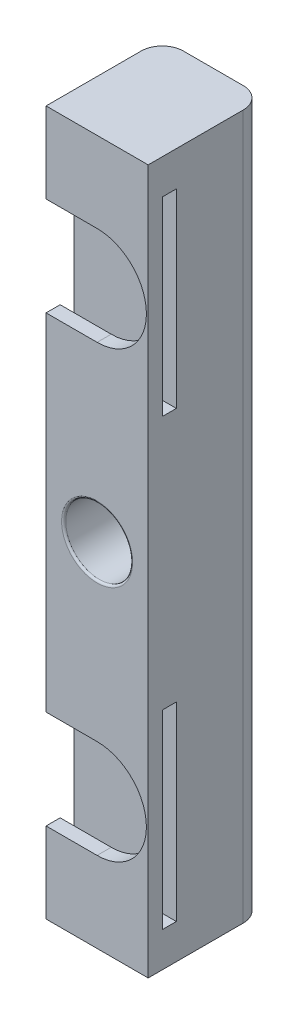
ISO-10303-21;
HEADER;
FILE_DESCRIPTION(('STEP AP214'),'2;1');
FILE_NAME('part.step','',(''),(''),'','','');
FILE_SCHEMA(('AUTOMOTIVE_DESIGN { 1 0 10303 214 1 1 1 1 }'));
ENDSEC;
DATA;
#1=APPLICATION_CONTEXT('core data for automotive mechanical design processes');
#2=APPLICATION_PROTOCOL_DEFINITION('international standard','automotive_design',2000,#1);
#3=PRODUCT_CONTEXT('',#1,'mechanical');
#4=PRODUCT('Part','Part','',(#3));
#5=PRODUCT_RELATED_PRODUCT_CATEGORY('part','',(#4));
#6=PRODUCT_DEFINITION_FORMATION('','',#4);
#7=PRODUCT_DEFINITION_CONTEXT('part definition',#1,'design');
#8=PRODUCT_DEFINITION('design','',#6,#7);
#9=PRODUCT_DEFINITION_SHAPE('','',#8);
#10=(LENGTH_UNIT() NAMED_UNIT(*) SI_UNIT(.MILLI.,.METRE.));
#11=(NAMED_UNIT(*) PLANE_ANGLE_UNIT() SI_UNIT($,.RADIAN.));
#12=(NAMED_UNIT(*) SI_UNIT($,.STERADIAN.) SOLID_ANGLE_UNIT());
#13=UNCERTAINTY_MEASURE_WITH_UNIT(LENGTH_MEASURE(1.E-05),#10,'distance_accuracy_value','');
#14=(GEOMETRIC_REPRESENTATION_CONTEXT(3) GLOBAL_UNCERTAINTY_ASSIGNED_CONTEXT((#13)) GLOBAL_UNIT_ASSIGNED_CONTEXT((#10,
#11,#12)) REPRESENTATION_CONTEXT('',''));
#15=CARTESIAN_POINT('',(0.,0.,0.));
#16=DIRECTION('',(0.,0.,1.));
#17=DIRECTION('',(1.,0.,0.));
#18=AXIS2_PLACEMENT_3D('',#15,#16,#17);
#19=CARTESIAN_POINT('',(4.25,-50.,3.));
#20=DIRECTION('',(0.,-1.,0.));
#21=DIRECTION('',(0.,0.,-1.));
#22=AXIS2_PLACEMENT_3D('',#19,#20,#21);
#23=CYLINDRICAL_SURFACE('',#22,3.);
#24=DIRECTION('',(0.,1.,0.));
#25=VECTOR('',#24,1.);
#26=CARTESIAN_POINT('',(7.25,-50.,3.));
#27=LINE('',#26,#25);
#28=CARTESIAN_POINT('',(7.25,-50.,3.));
#29=VERTEX_POINT('',#28);
#30=CARTESIAN_POINT('',(7.25,50.,3.));
#31=VERTEX_POINT('',#30);
#32=EDGE_CURVE('E341',#29,#31,#27,.T.);
#33=ORIENTED_EDGE('',*,*,#32,.F.);
#34=CARTESIAN_POINT('',(4.25,-50.,3.));
#35=DIRECTION('',(0.,1.,0.));
#36=DIRECTION('',(0.,0.,1.));
#37=AXIS2_PLACEMENT_3D('',#34,#35,#36);
#38=CIRCLE('',#37,3.);
#39=CARTESIAN_POINT('',(4.25,-50.,0.));
#40=VERTEX_POINT('',#39);
#41=EDGE_CURVE('E63',#40,#29,#38,.F.);
#42=ORIENTED_EDGE('',*,*,#41,.F.);
#43=DIRECTION('',(0.,1.,0.));
#44=VECTOR('',#43,1.);
#45=CARTESIAN_POINT('',(4.25,-50.,0.));
#46=LINE('',#45,#44);
#47=CARTESIAN_POINT('',(4.25,50.,0.));
#48=VERTEX_POINT('',#47);
#49=EDGE_CURVE('E346',#48,#40,#46,.F.);
#50=ORIENTED_EDGE('',*,*,#49,.F.);
#51=CARTESIAN_POINT('',(4.25,50.,3.));
#52=DIRECTION('',(0.,-1.,0.));
#53=DIRECTION('',(0.,0.,-1.));
#54=AXIS2_PLACEMENT_3D('',#51,#52,#53);
#55=CIRCLE('',#54,3.);
#56=EDGE_CURVE('E53',#31,#48,#55,.F.);
#57=ORIENTED_EDGE('',*,*,#56,.F.);
#58=EDGE_LOOP('',(#33,#42,#50,#57));
#59=FACE_BOUND('',#58,.T.);
#60=ADVANCED_FACE('F39',(#59),#23,.T.);
#61=CARTESIAN_POINT('',(-4.25,-50.,3.));
#62=DIRECTION('',(0.,1.,0.));
#63=DIRECTION('',(0.,0.,1.));
#64=AXIS2_PLACEMENT_3D('',#61,#62,#63);
#65=CYLINDRICAL_SURFACE('',#64,3.);
#66=DIRECTION('',(0.,-1.,0.));
#67=VECTOR('',#66,1.);
#68=CARTESIAN_POINT('',(-7.25,-50.,3.));
#69=LINE('',#68,#67);
#70=CARTESIAN_POINT('',(-7.25,50.,3.));
#71=VERTEX_POINT('',#70);
#72=CARTESIAN_POINT('',(-7.25,-50.,3.));
#73=VERTEX_POINT('',#72);
#74=EDGE_CURVE('E332',#71,#73,#69,.T.);
#75=ORIENTED_EDGE('',*,*,#74,.F.);
#76=CARTESIAN_POINT('',(-4.25,50.,3.));
#77=DIRECTION('',(0.,-1.,0.));
#78=DIRECTION('',(0.,0.,-1.));
#79=AXIS2_PLACEMENT_3D('',#76,#77,#78);
#80=CIRCLE('',#79,3.);
#81=CARTESIAN_POINT('',(-4.25,50.,0.));
#82=VERTEX_POINT('',#81);
#83=EDGE_CURVE('E339',#82,#71,#80,.F.);
#84=ORIENTED_EDGE('',*,*,#83,.F.);
#85=DIRECTION('',(0.,-1.,0.));
#86=VECTOR('',#85,1.);
#87=CARTESIAN_POINT('',(-4.25,-50.,0.));
#88=LINE('',#87,#86);
#89=CARTESIAN_POINT('',(-4.25,-50.,0.));
#90=VERTEX_POINT('',#89);
#91=EDGE_CURVE('E337',#90,#82,#88,.F.);
#92=ORIENTED_EDGE('',*,*,#91,.F.);
#93=CARTESIAN_POINT('',(-4.25,-50.,3.));
#94=DIRECTION('',(0.,1.,0.));
#95=DIRECTION('',(0.,0.,1.));
#96=AXIS2_PLACEMENT_3D('',#93,#94,#95);
#97=CIRCLE('',#96,3.);
#98=EDGE_CURVE('E343',#73,#90,#97,.F.);
#99=ORIENTED_EDGE('',*,*,#98,.F.);
#100=EDGE_LOOP('',(#75,#84,#92,#99));
#101=FACE_BOUND('',#100,.T.);
#102=ADVANCED_FACE('F362',(#101),#65,.T.);
#103=CARTESIAN_POINT('',(0.,0.,16.5));
#104=DIRECTION('',(0.,0.,-1.));
#105=DIRECTION('',(-1.,0.,0.));
#106=AXIS2_PLACEMENT_3D('',#103,#104,#105);
#107=PLANE('',#106);
#108=CARTESIAN_POINT('',(0.,0.,16.5));
#109=DIRECTION('',(0.,0.,-1.));
#110=DIRECTION('',(-1.,0.,0.));
#111=AXIS2_PLACEMENT_3D('',#108,#109,#110);
#112=CIRCLE('',#111,5.05);
#113=CARTESIAN_POINT('',(-5.05,0.,16.5));
#114=VERTEX_POINT('',#113);
#115=EDGE_CURVE('E11',#114,#114,#112,.T.);
#116=ORIENTED_EDGE('',*,*,#115,.T.);
#117=EDGE_LOOP('',(#116));
#118=FACE_BOUND('',#117,.T.);
#119=DIRECTION('',(0.,-1.,0.));
#120=VECTOR('',#119,1.);
#121=CARTESIAN_POINT('',(-7.25,-50.,16.5));
#122=LINE('',#121,#120);
#123=CARTESIAN_POINT('',(-7.25,50.,16.5));
#124=VERTEX_POINT('',#123);
#125=CARTESIAN_POINT('',(-7.25,38.55,16.5));
#126=VERTEX_POINT('',#125);
#127=EDGE_CURVE('E292',#124,#126,#122,.T.);
#128=ORIENTED_EDGE('',*,*,#127,.T.);
#129=DIRECTION('',(1.,0.,0.));
#130=VECTOR('',#129,1.);
#131=CARTESIAN_POINT('',(0.,38.55,16.5));
#132=LINE('',#131,#130);
#133=CARTESIAN_POINT('',(0.,38.55,16.5));
#134=VERTEX_POINT('',#133);
#135=EDGE_CURVE('E192',#126,#134,#132,.T.);
#136=ORIENTED_EDGE('',*,*,#135,.T.);
#137=CARTESIAN_POINT('',(0.,31.55,16.5));
#138=DIRECTION('',(0.,0.,-1.));
#139=DIRECTION('',(1.,0.,0.));
#140=AXIS2_PLACEMENT_3D('',#137,#138,#139);
#141=CIRCLE('',#140,7.);
#142=CARTESIAN_POINT('',(0.,24.55,16.5));
#143=VERTEX_POINT('',#142);
#144=EDGE_CURVE('E458',#134,#143,#141,.T.);
#145=ORIENTED_EDGE('',*,*,#144,.T.);
#146=DIRECTION('',(-1.,0.,0.));
#147=VECTOR('',#146,1.);
#148=CARTESIAN_POINT('',(0.,24.55,16.5));
#149=LINE('',#148,#147);
#150=CARTESIAN_POINT('',(-7.25,24.55,16.5));
#151=VERTEX_POINT('',#150);
#152=EDGE_CURVE('E448',#143,#151,#149,.T.);
#153=ORIENTED_EDGE('',*,*,#152,.T.);
#154=CARTESIAN_POINT('',(-7.25,-24.55,16.5));
#155=VERTEX_POINT('',#154);
#156=EDGE_CURVE('E294',#151,#155,#122,.T.);
#157=ORIENTED_EDGE('',*,*,#156,.T.);
#158=DIRECTION('',(-1.,0.,0.));
#159=VECTOR('',#158,1.);
#160=CARTESIAN_POINT('',(0.,-24.55,16.5));
#161=LINE('',#160,#159);
#162=CARTESIAN_POINT('',(0.,-24.55,16.5));
#163=VERTEX_POINT('',#162);
#164=EDGE_CURVE('E244',#163,#155,#161,.T.);
#165=ORIENTED_EDGE('',*,*,#164,.F.);
#166=CARTESIAN_POINT('',(0.,-31.55,16.5));
#167=DIRECTION('',(0.,0.,1.));
#168=DIRECTION('',(1.,0.,0.));
#169=AXIS2_PLACEMENT_3D('',#166,#167,#168);
#170=CIRCLE('',#169,7.);
#171=CARTESIAN_POINT('',(0.,-38.55,16.5));
#172=VERTEX_POINT('',#171);
#173=EDGE_CURVE('E233',#172,#163,#170,.T.);
#174=ORIENTED_EDGE('',*,*,#173,.F.);
#175=DIRECTION('',(1.,0.,0.));
#176=VECTOR('',#175,1.);
#177=CARTESIAN_POINT('',(0.,-38.55,16.5));
#178=LINE('',#177,#176);
#179=CARTESIAN_POINT('',(-7.25,-38.55,16.5));
#180=VERTEX_POINT('',#179);
#181=EDGE_CURVE('E236',#180,#172,#178,.T.);
#182=ORIENTED_EDGE('',*,*,#181,.F.);
#183=CARTESIAN_POINT('',(-7.25,-50.,16.5));
#184=VERTEX_POINT('',#183);
#185=EDGE_CURVE('E289',#180,#184,#122,.T.);
#186=ORIENTED_EDGE('',*,*,#185,.T.);
#187=DIRECTION('',(1.,0.,0.));
#188=VECTOR('',#187,1.);
#189=CARTESIAN_POINT('',(7.25,-50.,16.5));
#190=LINE('',#189,#188);
#191=CARTESIAN_POINT('',(7.25,-50.,16.5));
#192=VERTEX_POINT('',#191);
#193=EDGE_CURVE('E295',#184,#192,#190,.T.);
#194=ORIENTED_EDGE('',*,*,#193,.T.);
#195=DIRECTION('',(0.,1.,0.));
#196=VECTOR('',#195,1.);
#197=CARTESIAN_POINT('',(7.25,-50.,16.5));
#198=LINE('',#197,#196);
#199=CARTESIAN_POINT('',(7.25,50.,16.5));
#200=VERTEX_POINT('',#199);
#201=EDGE_CURVE('E300',#192,#200,#198,.T.);
#202=ORIENTED_EDGE('',*,*,#201,.T.);
#203=DIRECTION('',(-1.,0.,0.));
#204=VECTOR('',#203,1.);
#205=CARTESIAN_POINT('',(7.25,50.,16.5));
#206=LINE('',#205,#204);
#207=EDGE_CURVE('E290',#200,#124,#206,.T.);
#208=ORIENTED_EDGE('',*,*,#207,.T.);
#209=EDGE_LOOP('',(#128,#136,#145,#153,#157,#165,#174,#182,#186,#194,#202,#208));
#210=FACE_BOUND('',#209,.T.);
#211=ADVANCED_FACE('F371',(#118,#210),#107,.F.);
#212=CARTESIAN_POINT('',(0.,0.,14.5));
#213=DIRECTION('',(0.,0.,-1.));
#214=DIRECTION('',(-1.,0.,0.));
#215=AXIS2_PLACEMENT_3D('',#212,#213,#214);
#216=PLANE('',#215);
#217=DIRECTION('',(-1.,0.,0.));
#218=VECTOR('',#217,1.);
#219=CARTESIAN_POINT('',(0.,24.55,14.5));
#220=LINE('',#219,#218);
#221=CARTESIAN_POINT('',(0.,24.55,14.5));
#222=VERTEX_POINT('',#221);
#223=CARTESIAN_POINT('',(-7.25,24.55,14.5));
#224=VERTEX_POINT('',#223);
#225=EDGE_CURVE('E210',#222,#224,#220,.T.);
#226=ORIENTED_EDGE('',*,*,#225,.F.);
#227=CARTESIAN_POINT('',(0.,31.55,14.5));
#228=DIRECTION('',(0.,0.,-1.));
#229=DIRECTION('',(1.,0.,0.));
#230=AXIS2_PLACEMENT_3D('',#227,#228,#229);
#231=CIRCLE('',#230,7.);
#232=CARTESIAN_POINT('',(0.,38.55,14.5));
#233=VERTEX_POINT('',#232);
#234=EDGE_CURVE('E207',#233,#222,#231,.T.);
#235=ORIENTED_EDGE('',*,*,#234,.F.);
#236=DIRECTION('',(1.,0.,0.));
#237=VECTOR('',#236,1.);
#238=CARTESIAN_POINT('',(0.,38.55,14.5));
#239=LINE('',#238,#237);
#240=CARTESIAN_POINT('',(-7.25,38.55,14.5));
#241=VERTEX_POINT('',#240);
#242=EDGE_CURVE('E193',#241,#233,#239,.T.);
#243=ORIENTED_EDGE('',*,*,#242,.F.);
#244=DIRECTION('',(0.,1.,0.));
#245=VECTOR('',#244,1.);
#246=CARTESIAN_POINT('',(-7.25,-50.,14.5));
#247=LINE('',#246,#245);
#248=CARTESIAN_POINT('',(-7.25,45.05,14.5));
#249=VERTEX_POINT('',#248);
#250=EDGE_CURVE('E203',#241,#249,#247,.T.);
#251=ORIENTED_EDGE('',*,*,#250,.T.);
#252=DIRECTION('',(1.,0.,0.));
#253=VECTOR('',#252,1.);
#254=CARTESIAN_POINT('',(-13.5,45.05,14.5));
#255=LINE('',#254,#253);
#256=CARTESIAN_POINT('',(7.25,45.05,14.5));
#257=VERTEX_POINT('',#256);
#258=EDGE_CURVE('E460',#249,#257,#255,.T.);
#259=ORIENTED_EDGE('',*,*,#258,.T.);
#260=DIRECTION('',(0.,-1.,0.));
#261=VECTOR('',#260,1.);
#262=CARTESIAN_POINT('',(7.25,-50.,14.5));
#263=LINE('',#262,#261);
#264=CARTESIAN_POINT('',(7.25,18.05,14.5));
#265=VERTEX_POINT('',#264);
#266=EDGE_CURVE('E321',#257,#265,#263,.T.);
#267=ORIENTED_EDGE('',*,*,#266,.T.);
#268=DIRECTION('',(-1.,0.,0.));
#269=VECTOR('',#268,1.);
#270=CARTESIAN_POINT('',(-13.5,18.05,14.5));
#271=LINE('',#270,#269);
#272=CARTESIAN_POINT('',(-7.25,18.05,14.5));
#273=VERTEX_POINT('',#272);
#274=EDGE_CURVE('E223',#265,#273,#271,.T.);
#275=ORIENTED_EDGE('',*,*,#274,.T.);
#276=EDGE_CURVE('E212',#273,#224,#247,.T.);
#277=ORIENTED_EDGE('',*,*,#276,.T.);
#278=EDGE_LOOP('',(#226,#235,#243,#251,#259,#267,#275,#277));
#279=FACE_BOUND('',#278,.T.);
#280=ADVANCED_FACE('F202',(#279),#216,.T.);
#281=CARTESIAN_POINT('',(0.,0.,14.5));
#282=DIRECTION('',(0.,0.,-1.));
#283=DIRECTION('',(-1.,0.,0.));
#284=AXIS2_PLACEMENT_3D('',#281,#282,#283);
#285=PLANE('',#284);
#286=DIRECTION('',(0.,1.,0.));
#287=VECTOR('',#286,1.);
#288=CARTESIAN_POINT('',(-7.25,-50.,14.5));
#289=LINE('',#288,#287);
#290=CARTESIAN_POINT('',(-7.25,-45.05,14.5));
#291=VERTEX_POINT('',#290);
#292=CARTESIAN_POINT('',(-7.25,-38.55,14.5));
#293=VERTEX_POINT('',#292);
#294=EDGE_CURVE('E272',#291,#293,#289,.T.);
#295=ORIENTED_EDGE('',*,*,#294,.T.);
#296=DIRECTION('',(1.,0.,0.));
#297=VECTOR('',#296,1.);
#298=CARTESIAN_POINT('',(0.,-38.55,14.5));
#299=LINE('',#298,#297);
#300=CARTESIAN_POINT('',(0.,-38.55,14.5));
#301=VERTEX_POINT('',#300);
#302=EDGE_CURVE('E237',#293,#301,#299,.T.);
#303=ORIENTED_EDGE('',*,*,#302,.T.);
#304=CARTESIAN_POINT('',(0.,-31.55,14.5));
#305=DIRECTION('',(0.,0.,1.));
#306=DIRECTION('',(1.,0.,0.));
#307=AXIS2_PLACEMENT_3D('',#304,#305,#306);
#308=CIRCLE('',#307,7.);
#309=CARTESIAN_POINT('',(0.,-24.55,14.5));
#310=VERTEX_POINT('',#309);
#311=EDGE_CURVE('E235',#301,#310,#308,.T.);
#312=ORIENTED_EDGE('',*,*,#311,.T.);
#313=DIRECTION('',(-1.,0.,0.));
#314=VECTOR('',#313,1.);
#315=CARTESIAN_POINT('',(0.,-24.55,14.5));
#316=LINE('',#315,#314);
#317=CARTESIAN_POINT('',(-7.25,-24.55,14.5));
#318=VERTEX_POINT('',#317);
#319=EDGE_CURVE('E232',#310,#318,#316,.T.);
#320=ORIENTED_EDGE('',*,*,#319,.T.);
#321=CARTESIAN_POINT('',(-7.25,-18.05,14.5));
#322=VERTEX_POINT('',#321);
#323=EDGE_CURVE('E266',#318,#322,#289,.T.);
#324=ORIENTED_EDGE('',*,*,#323,.T.);
#325=DIRECTION('',(-1.,0.,0.));
#326=VECTOR('',#325,1.);
#327=CARTESIAN_POINT('',(-13.5,-18.05,14.5));
#328=LINE('',#327,#326);
#329=CARTESIAN_POINT('',(7.25,-18.05,14.5));
#330=VERTEX_POINT('',#329);
#331=EDGE_CURVE('E255',#330,#322,#328,.T.);
#332=ORIENTED_EDGE('',*,*,#331,.F.);
#333=DIRECTION('',(0.,-1.,0.));
#334=VECTOR('',#333,1.);
#335=CARTESIAN_POINT('',(7.25,-50.,14.5));
#336=LINE('',#335,#334);
#337=CARTESIAN_POINT('',(7.25,-45.05,14.5));
#338=VERTEX_POINT('',#337);
#339=EDGE_CURVE('E315',#330,#338,#336,.T.);
#340=ORIENTED_EDGE('',*,*,#339,.T.);
#341=DIRECTION('',(1.,0.,0.));
#342=VECTOR('',#341,1.);
#343=CARTESIAN_POINT('',(-13.5,-45.05,14.5));
#344=LINE('',#343,#342);
#345=EDGE_CURVE('E264',#291,#338,#344,.T.);
#346=ORIENTED_EDGE('',*,*,#345,.F.);
#347=EDGE_LOOP('',(#295,#303,#312,#320,#324,#332,#340,#346));
#348=FACE_BOUND('',#347,.T.);
#349=ADVANCED_FACE('F380',(#348),#285,.T.);
#350=CARTESIAN_POINT('',(7.25,50.,16.5));
#351=DIRECTION('',(0.,-1.,0.));
#352=DIRECTION('',(0.,0.,-1.));
#353=AXIS2_PLACEMENT_3D('',#350,#351,#352);
#354=PLANE('',#353);
#355=DIRECTION('',(0.,0.,-1.));
#356=VECTOR('',#355,1.);
#357=CARTESIAN_POINT('',(7.25,50.,16.5));
#358=LINE('',#357,#356);
#359=EDGE_CURVE('E299',#200,#31,#358,.T.);
#360=ORIENTED_EDGE('',*,*,#359,.T.);
#361=ORIENTED_EDGE('',*,*,#56,.T.);
#362=DIRECTION('',(-1.,0.,0.));
#363=VECTOR('',#362,1.);
#364=CARTESIAN_POINT('',(7.25,50.,0.));
#365=LINE('',#364,#363);
#366=EDGE_CURVE('E286',#48,#82,#365,.T.);
#367=ORIENTED_EDGE('',*,*,#366,.T.);
#368=ORIENTED_EDGE('',*,*,#83,.T.);
#369=DIRECTION('',(0.,0.,-1.));
#370=VECTOR('',#369,1.);
#371=CARTESIAN_POINT('',(-7.25,50.,16.5));
#372=LINE('',#371,#370);
#373=EDGE_CURVE('E309',#124,#71,#372,.T.);
#374=ORIENTED_EDGE('',*,*,#373,.F.);
#375=ORIENTED_EDGE('',*,*,#207,.F.);
#376=EDGE_LOOP('',(#360,#361,#367,#368,#374,#375));
#377=FACE_BOUND('',#376,.T.);
#378=ADVANCED_FACE('F374',(#377),#354,.F.);
#379=CARTESIAN_POINT('',(-7.25,-50.,16.5));
#380=DIRECTION('',(1.,0.,0.));
#381=DIRECTION('',(0.,0.,-1.));
#382=AXIS2_PLACEMENT_3D('',#379,#380,#381);
#383=PLANE('',#382);
#384=ORIENTED_EDGE('',*,*,#373,.T.);
#385=ORIENTED_EDGE('',*,*,#74,.T.);
#386=DIRECTION('',(0.,0.,-1.));
#387=VECTOR('',#386,1.);
#388=CARTESIAN_POINT('',(-7.25,-50.,16.5));
#389=LINE('',#388,#387);
#390=EDGE_CURVE('E310',#184,#73,#389,.T.);
#391=ORIENTED_EDGE('',*,*,#390,.F.);
#392=ORIENTED_EDGE('',*,*,#185,.F.);
#393=DIRECTION('',(0.,0.,1.));
#394=VECTOR('',#393,1.);
#395=CARTESIAN_POINT('',(-7.25,-38.55,14.5));
#396=LINE('',#395,#394);
#397=EDGE_CURVE('E254',#293,#180,#396,.T.);
#398=ORIENTED_EDGE('',*,*,#397,.F.);
#399=ORIENTED_EDGE('',*,*,#294,.F.);
#400=DIRECTION('',(0.,0.,-1.));
#401=VECTOR('',#400,1.);
#402=CARTESIAN_POINT('',(-7.25,-45.05,16.5));
#403=LINE('',#402,#401);
#404=CARTESIAN_POINT('',(-7.25,-45.05,12.5));
#405=VERTEX_POINT('',#404);
#406=EDGE_CURVE('E279',#291,#405,#403,.T.);
#407=ORIENTED_EDGE('',*,*,#406,.T.);
#408=DIRECTION('',(0.,1.,0.));
#409=VECTOR('',#408,1.);
#410=CARTESIAN_POINT('',(-7.25,-50.,12.5));
#411=LINE('',#410,#409);
#412=CARTESIAN_POINT('',(-7.25,-18.05,12.5));
#413=VERTEX_POINT('',#412);
#414=EDGE_CURVE('E274',#405,#413,#411,.T.);
#415=ORIENTED_EDGE('',*,*,#414,.T.);
#416=DIRECTION('',(0.,0.,1.));
#417=VECTOR('',#416,1.);
#418=CARTESIAN_POINT('',(-7.25,-18.05,16.5));
#419=LINE('',#418,#417);
#420=EDGE_CURVE('E280',#413,#322,#419,.T.);
#421=ORIENTED_EDGE('',*,*,#420,.T.);
#422=ORIENTED_EDGE('',*,*,#323,.F.);
#423=DIRECTION('',(0.,0.,1.));
#424=VECTOR('',#423,1.);
#425=CARTESIAN_POINT('',(-7.25,-24.55,14.5));
#426=LINE('',#425,#424);
#427=EDGE_CURVE('E253',#318,#155,#426,.T.);
#428=ORIENTED_EDGE('',*,*,#427,.T.);
#429=ORIENTED_EDGE('',*,*,#156,.F.);
#430=DIRECTION('',(0.,0.,1.));
#431=VECTOR('',#430,1.);
#432=CARTESIAN_POINT('',(-7.25,24.55,14.5));
#433=LINE('',#432,#431);
#434=EDGE_CURVE('E199',#224,#151,#433,.T.);
#435=ORIENTED_EDGE('',*,*,#434,.F.);
#436=ORIENTED_EDGE('',*,*,#276,.F.);
#437=DIRECTION('',(0.,0.,1.));
#438=VECTOR('',#437,1.);
#439=CARTESIAN_POINT('',(-7.25,18.05,16.5));
#440=LINE('',#439,#438);
#441=CARTESIAN_POINT('',(-7.25,18.05,12.5));
#442=VERTEX_POINT('',#441);
#443=EDGE_CURVE('E226',#442,#273,#440,.T.);
#444=ORIENTED_EDGE('',*,*,#443,.F.);
#445=DIRECTION('',(0.,1.,0.));
#446=VECTOR('',#445,1.);
#447=CARTESIAN_POINT('',(-7.25,-50.,12.5));
#448=LINE('',#447,#446);
#449=CARTESIAN_POINT('',(-7.25,45.05,12.5));
#450=VERTEX_POINT('',#449);
#451=EDGE_CURVE('E219',#442,#450,#448,.T.);
#452=ORIENTED_EDGE('',*,*,#451,.T.);
#453=DIRECTION('',(0.,0.,-1.));
#454=VECTOR('',#453,1.);
#455=CARTESIAN_POINT('',(-7.25,45.05,16.5));
#456=LINE('',#455,#454);
#457=EDGE_CURVE('E211',#249,#450,#456,.T.);
#458=ORIENTED_EDGE('',*,*,#457,.F.);
#459=ORIENTED_EDGE('',*,*,#250,.F.);
#460=DIRECTION('',(0.,0.,1.));
#461=VECTOR('',#460,1.);
#462=CARTESIAN_POINT('',(-7.25,38.55,14.5));
#463=LINE('',#462,#461);
#464=EDGE_CURVE('E189',#241,#126,#463,.T.);
#465=ORIENTED_EDGE('',*,*,#464,.T.);
#466=ORIENTED_EDGE('',*,*,#127,.F.);
#467=EDGE_LOOP('',(#384,#385,#391,#392,#398,#399,#407,#415,#421,#422,#428,#429,#435,#436,#444,
#452,#458,#459,#465,#466));
#468=FACE_BOUND('',#467,.T.);
#469=ADVANCED_FACE('F213',(#468),#383,.F.);
#470=CARTESIAN_POINT('',(7.25,-50.,16.5));
#471=DIRECTION('',(0.,1.,0.));
#472=DIRECTION('',(0.,0.,1.));
#473=AXIS2_PLACEMENT_3D('',#470,#471,#472);
#474=PLANE('',#473);
#475=DIRECTION('',(1.,0.,0.));
#476=VECTOR('',#475,1.);
#477=CARTESIAN_POINT('',(7.25,-50.,0.));
#478=LINE('',#477,#476);
#479=EDGE_CURVE('E293',#90,#40,#478,.T.);
#480=ORIENTED_EDGE('',*,*,#479,.T.);
#481=ORIENTED_EDGE('',*,*,#41,.T.);
#482=DIRECTION('',(0.,0.,-1.));
#483=VECTOR('',#482,1.);
#484=CARTESIAN_POINT('',(7.25,-50.,16.5));
#485=LINE('',#484,#483);
#486=EDGE_CURVE('E302',#192,#29,#485,.T.);
#487=ORIENTED_EDGE('',*,*,#486,.F.);
#488=ORIENTED_EDGE('',*,*,#193,.F.);
#489=ORIENTED_EDGE('',*,*,#390,.T.);
#490=ORIENTED_EDGE('',*,*,#98,.T.);
#491=EDGE_LOOP('',(#480,#481,#487,#488,#489,#490));
#492=FACE_BOUND('',#491,.T.);
#493=ADVANCED_FACE('F378',(#492),#474,.F.);
#494=CARTESIAN_POINT('',(7.25,-50.,16.5));
#495=DIRECTION('',(-1.,0.,0.));
#496=DIRECTION('',(0.,0.,1.));
#497=AXIS2_PLACEMENT_3D('',#494,#495,#496);
#498=PLANE('',#497);
#499=DIRECTION('',(0.,0.,1.));
#500=VECTOR('',#499,1.);
#501=CARTESIAN_POINT('',(7.25,45.05,16.5));
#502=LINE('',#501,#500);
#503=CARTESIAN_POINT('',(7.25,45.05,12.5));
#504=VERTEX_POINT('',#503);
#505=EDGE_CURVE('E324',#504,#257,#502,.T.);
#506=ORIENTED_EDGE('',*,*,#505,.F.);
#507=DIRECTION('',(0.,-1.,0.));
#508=VECTOR('',#507,1.);
#509=CARTESIAN_POINT('',(7.25,-50.,12.5));
#510=LINE('',#509,#508);
#511=CARTESIAN_POINT('',(7.25,18.05,12.5));
#512=VERTEX_POINT('',#511);
#513=EDGE_CURVE('E330',#504,#512,#510,.T.);
#514=ORIENTED_EDGE('',*,*,#513,.T.);
#515=DIRECTION('',(0.,0.,-1.));
#516=VECTOR('',#515,1.);
#517=CARTESIAN_POINT('',(7.25,18.05,16.5));
#518=LINE('',#517,#516);
#519=EDGE_CURVE('E329',#265,#512,#518,.T.);
#520=ORIENTED_EDGE('',*,*,#519,.F.);
#521=ORIENTED_EDGE('',*,*,#266,.F.);
#522=EDGE_LOOP('',(#506,#514,#520,#521));
#523=FACE_BOUND('',#522,.T.);
#524=DIRECTION('',(0.,0.,-1.));
#525=VECTOR('',#524,1.);
#526=CARTESIAN_POINT('',(7.25,-18.05,16.5));
#527=LINE('',#526,#525);
#528=CARTESIAN_POINT('',(7.25,-18.05,12.5));
#529=VERTEX_POINT('',#528);
#530=EDGE_CURVE('E313',#330,#529,#527,.T.);
#531=ORIENTED_EDGE('',*,*,#530,.T.);
#532=DIRECTION('',(0.,-1.,0.));
#533=VECTOR('',#532,1.);
#534=CARTESIAN_POINT('',(7.25,-50.,12.5));
#535=LINE('',#534,#533);
#536=CARTESIAN_POINT('',(7.25,-45.05,12.5));
#537=VERTEX_POINT('',#536);
#538=EDGE_CURVE('E318',#529,#537,#535,.T.);
#539=ORIENTED_EDGE('',*,*,#538,.T.);
#540=DIRECTION('',(0.,0.,1.));
#541=VECTOR('',#540,1.);
#542=CARTESIAN_POINT('',(7.25,-45.05,16.5));
#543=LINE('',#542,#541);
#544=EDGE_CURVE('E320',#537,#338,#543,.T.);
#545=ORIENTED_EDGE('',*,*,#544,.T.);
#546=ORIENTED_EDGE('',*,*,#339,.F.);
#547=EDGE_LOOP('',(#531,#539,#545,#546));
#548=FACE_BOUND('',#547,.T.);
#549=ORIENTED_EDGE('',*,*,#486,.T.);
#550=ORIENTED_EDGE('',*,*,#32,.T.);
#551=ORIENTED_EDGE('',*,*,#359,.F.);
#552=ORIENTED_EDGE('',*,*,#201,.F.);
#553=EDGE_LOOP('',(#549,#550,#551,#552));
#554=FACE_BOUND('',#553,.T.);
#555=ADVANCED_FACE('F385',(#523,#548,#554),#498,.F.);
#556=CARTESIAN_POINT('',(0.,0.,0.));
#557=DIRECTION('',(0.,0.,-1.));
#558=DIRECTION('',(-1.,0.,0.));
#559=AXIS2_PLACEMENT_3D('',#556,#557,#558);
#560=PLANE('',#559);
#561=ORIENTED_EDGE('',*,*,#366,.F.);
#562=ORIENTED_EDGE('',*,*,#49,.T.);
#563=ORIENTED_EDGE('',*,*,#479,.F.);
#564=ORIENTED_EDGE('',*,*,#91,.T.);
#565=EDGE_LOOP('',(#561,#562,#563,#564));
#566=FACE_BOUND('',#565,.T.);
#567=ADVANCED_FACE('F388',(#566),#560,.T.);
#568=CARTESIAN_POINT('',(0.,0.,0.5));
#569=DIRECTION('',(0.,0.,1.));
#570=DIRECTION('',(1.,0.,0.));
#571=AXIS2_PLACEMENT_3D('',#568,#569,#570);
#572=CYLINDRICAL_SURFACE('',#571,4.75);
#573=CARTESIAN_POINT('',(0.,0.,16.2));
#574=DIRECTION('',(0.,0.,-1.));
#575=DIRECTION('',(-1.,0.,0.));
#576=AXIS2_PLACEMENT_3D('',#573,#574,#575);
#577=CIRCLE('',#576,4.75);
#578=CARTESIAN_POINT('',(-4.75,0.,16.2));
#579=VERTEX_POINT('',#578);
#580=EDGE_CURVE('E50',#579,#579,#577,.F.);
#581=ORIENTED_EDGE('',*,*,#580,.T.);
#582=EDGE_LOOP('',(#581));
#583=FACE_BOUND('',#582,.T.);
#584=CARTESIAN_POINT('',(0.,0.,0.5));
#585=DIRECTION('',(0.,0.,1.));
#586=DIRECTION('',(1.,0.,0.));
#587=AXIS2_PLACEMENT_3D('',#584,#585,#586);
#588=CIRCLE('',#587,4.75);
#589=CARTESIAN_POINT('',(4.75,0.,0.5));
#590=VERTEX_POINT('',#589);
#591=EDGE_CURVE('E284',#590,#590,#588,.T.);
#592=ORIENTED_EDGE('',*,*,#591,.F.);
#593=EDGE_LOOP('',(#592));
#594=FACE_BOUND('',#593,.T.);
#595=ADVANCED_FACE('F355',(#583,#594),#572,.F.);
#596=CARTESIAN_POINT('',(0.,0.,0.5));
#597=DIRECTION('',(0.,0.,1.));
#598=DIRECTION('',(1.,0.,0.));
#599=AXIS2_PLACEMENT_3D('',#596,#597,#598);
#600=PLANE('',#599);
#601=ORIENTED_EDGE('',*,*,#591,.T.);
#602=EDGE_LOOP('',(#601));
#603=FACE_BOUND('',#602,.T.);
#604=ADVANCED_FACE('F395',(#603),#600,.T.);
#605=CARTESIAN_POINT('',(-13.5,-45.05,12.5));
#606=DIRECTION('',(0.,-1.,0.));
#607=DIRECTION('',(0.,0.,-1.));
#608=AXIS2_PLACEMENT_3D('',#605,#606,#607);
#609=PLANE('',#608);
#610=ORIENTED_EDGE('',*,*,#345,.T.);
#611=ORIENTED_EDGE('',*,*,#544,.F.);
#612=DIRECTION('',(1.,0.,0.));
#613=VECTOR('',#612,1.);
#614=CARTESIAN_POINT('',(-13.5,-45.05,12.5));
#615=LINE('',#614,#613);
#616=EDGE_CURVE('E262',#405,#537,#615,.T.);
#617=ORIENTED_EDGE('',*,*,#616,.F.);
#618=ORIENTED_EDGE('',*,*,#406,.F.);
#619=EDGE_LOOP('',(#610,#611,#617,#618));
#620=FACE_BOUND('',#619,.T.);
#621=ADVANCED_FACE('F397',(#620),#609,.F.);
#622=CARTESIAN_POINT('',(-13.5,-18.05,12.5));
#623=DIRECTION('',(0.,1.,0.));
#624=DIRECTION('',(0.,0.,1.));
#625=AXIS2_PLACEMENT_3D('',#622,#623,#624);
#626=PLANE('',#625);
#627=DIRECTION('',(-1.,0.,0.));
#628=VECTOR('',#627,1.);
#629=CARTESIAN_POINT('',(-13.5,-18.05,12.5));
#630=LINE('',#629,#628);
#631=EDGE_CURVE('E257',#529,#413,#630,.T.);
#632=ORIENTED_EDGE('',*,*,#631,.F.);
#633=ORIENTED_EDGE('',*,*,#530,.F.);
#634=ORIENTED_EDGE('',*,*,#331,.T.);
#635=ORIENTED_EDGE('',*,*,#420,.F.);
#636=EDGE_LOOP('',(#632,#633,#634,#635));
#637=FACE_BOUND('',#636,.T.);
#638=ADVANCED_FACE('F399',(#637),#626,.F.);
#639=CARTESIAN_POINT('',(0.,0.,12.5));
#640=DIRECTION('',(0.,0.,-1.));
#641=DIRECTION('',(-1.,0.,0.));
#642=AXIS2_PLACEMENT_3D('',#639,#640,#641);
#643=PLANE('',#642);
#644=ORIENTED_EDGE('',*,*,#616,.T.);
#645=ORIENTED_EDGE('',*,*,#538,.F.);
#646=ORIENTED_EDGE('',*,*,#631,.T.);
#647=ORIENTED_EDGE('',*,*,#414,.F.);
#648=EDGE_LOOP('',(#644,#645,#646,#647));
#649=FACE_BOUND('',#648,.T.);
#650=ADVANCED_FACE('F401',(#649),#643,.F.);
#651=CARTESIAN_POINT('',(0.,-31.55,14.5));
#652=DIRECTION('',(0.,0.,1.));
#653=DIRECTION('',(1.,0.,0.));
#654=AXIS2_PLACEMENT_3D('',#651,#652,#653);
#655=CYLINDRICAL_SURFACE('',#654,7.);
#656=ORIENTED_EDGE('',*,*,#173,.T.);
#657=DIRECTION('',(0.,0.,1.));
#658=VECTOR('',#657,1.);
#659=CARTESIAN_POINT('',(0.,-24.55,14.5));
#660=LINE('',#659,#658);
#661=EDGE_CURVE('E245',#310,#163,#660,.T.);
#662=ORIENTED_EDGE('',*,*,#661,.F.);
#663=ORIENTED_EDGE('',*,*,#311,.F.);
#664=DIRECTION('',(0.,0.,1.));
#665=VECTOR('',#664,1.);
#666=CARTESIAN_POINT('',(0.,-38.55,14.5));
#667=LINE('',#666,#665);
#668=EDGE_CURVE('E249',#301,#172,#667,.T.);
#669=ORIENTED_EDGE('',*,*,#668,.T.);
#670=EDGE_LOOP('',(#656,#662,#663,#669));
#671=FACE_BOUND('',#670,.T.);
#672=ADVANCED_FACE('F414',(#671),#655,.F.);
#673=CARTESIAN_POINT('',(0.,-38.55,14.5));
#674=DIRECTION('',(0.,-1.,0.));
#675=DIRECTION('',(0.,0.,-1.));
#676=AXIS2_PLACEMENT_3D('',#673,#674,#675);
#677=PLANE('',#676);
#678=ORIENTED_EDGE('',*,*,#181,.T.);
#679=ORIENTED_EDGE('',*,*,#668,.F.);
#680=ORIENTED_EDGE('',*,*,#302,.F.);
#681=ORIENTED_EDGE('',*,*,#397,.T.);
#682=EDGE_LOOP('',(#678,#679,#680,#681));
#683=FACE_BOUND('',#682,.T.);
#684=ADVANCED_FACE('F420',(#683),#677,.F.);
#685=CARTESIAN_POINT('',(0.,-24.55,14.5));
#686=DIRECTION('',(0.,1.,0.));
#687=DIRECTION('',(0.,0.,1.));
#688=AXIS2_PLACEMENT_3D('',#685,#686,#687);
#689=PLANE('',#688);
#690=ORIENTED_EDGE('',*,*,#164,.T.);
#691=ORIENTED_EDGE('',*,*,#427,.F.);
#692=ORIENTED_EDGE('',*,*,#319,.F.);
#693=ORIENTED_EDGE('',*,*,#661,.T.);
#694=EDGE_LOOP('',(#690,#691,#692,#693));
#695=FACE_BOUND('',#694,.T.);
#696=ADVANCED_FACE('F418',(#695),#689,.F.);
#697=CARTESIAN_POINT('',(-13.5,18.05,12.5));
#698=DIRECTION('',(0.,1.,0.));
#699=DIRECTION('',(0.,0.,1.));
#700=AXIS2_PLACEMENT_3D('',#697,#698,#699);
#701=PLANE('',#700);
#702=ORIENTED_EDGE('',*,*,#443,.T.);
#703=ORIENTED_EDGE('',*,*,#274,.F.);
#704=ORIENTED_EDGE('',*,*,#519,.T.);
#705=DIRECTION('',(-1.,0.,0.));
#706=VECTOR('',#705,1.);
#707=CARTESIAN_POINT('',(-13.5,18.05,12.5));
#708=LINE('',#707,#706);
#709=EDGE_CURVE('E214',#512,#442,#708,.T.);
#710=ORIENTED_EDGE('',*,*,#709,.T.);
#711=EDGE_LOOP('',(#702,#703,#704,#710));
#712=FACE_BOUND('',#711,.T.);
#713=ADVANCED_FACE('F422',(#712),#701,.T.);
#714=CARTESIAN_POINT('',(-13.5,45.05,12.5));
#715=DIRECTION('',(0.,-1.,0.));
#716=DIRECTION('',(0.,0.,-1.));
#717=AXIS2_PLACEMENT_3D('',#714,#715,#716);
#718=PLANE('',#717);
#719=ORIENTED_EDGE('',*,*,#457,.T.);
#720=DIRECTION('',(1.,0.,0.));
#721=VECTOR('',#720,1.);
#722=CARTESIAN_POINT('',(-13.5,45.05,12.5));
#723=LINE('',#722,#721);
#724=EDGE_CURVE('E220',#450,#504,#723,.T.);
#725=ORIENTED_EDGE('',*,*,#724,.T.);
#726=ORIENTED_EDGE('',*,*,#505,.T.);
#727=ORIENTED_EDGE('',*,*,#258,.F.);
#728=EDGE_LOOP('',(#719,#725,#726,#727));
#729=FACE_BOUND('',#728,.T.);
#730=ADVANCED_FACE('F430',(#729),#718,.T.);
#731=CARTESIAN_POINT('',(0.,0.,12.5));
#732=DIRECTION('',(0.,0.,-1.));
#733=DIRECTION('',(-1.,0.,0.));
#734=AXIS2_PLACEMENT_3D('',#731,#732,#733);
#735=PLANE('',#734);
#736=ORIENTED_EDGE('',*,*,#709,.F.);
#737=ORIENTED_EDGE('',*,*,#513,.F.);
#738=ORIENTED_EDGE('',*,*,#724,.F.);
#739=ORIENTED_EDGE('',*,*,#451,.F.);
#740=EDGE_LOOP('',(#736,#737,#738,#739));
#741=FACE_BOUND('',#740,.T.);
#742=ADVANCED_FACE('F427',(#741),#735,.F.);
#743=CARTESIAN_POINT('',(0.,31.55,14.5));
#744=DIRECTION('',(0.,0.,1.));
#745=DIRECTION('',(1.,0.,0.));
#746=AXIS2_PLACEMENT_3D('',#743,#744,#745);
#747=CYLINDRICAL_SURFACE('',#746,7.);
#748=ORIENTED_EDGE('',*,*,#144,.F.);
#749=DIRECTION('',(0.,0.,1.));
#750=VECTOR('',#749,1.);
#751=CARTESIAN_POINT('',(0.,38.55,14.5));
#752=LINE('',#751,#750);
#753=EDGE_CURVE('E198',#233,#134,#752,.T.);
#754=ORIENTED_EDGE('',*,*,#753,.F.);
#755=ORIENTED_EDGE('',*,*,#234,.T.);
#756=DIRECTION('',(0.,0.,1.));
#757=VECTOR('',#756,1.);
#758=CARTESIAN_POINT('',(0.,24.55,14.5));
#759=LINE('',#758,#757);
#760=EDGE_CURVE('E455',#222,#143,#759,.T.);
#761=ORIENTED_EDGE('',*,*,#760,.T.);
#762=EDGE_LOOP('',(#748,#754,#755,#761));
#763=FACE_BOUND('',#762,.T.);
#764=ADVANCED_FACE('F437',(#763),#747,.F.);
#765=CARTESIAN_POINT('',(0.,24.55,14.5));
#766=DIRECTION('',(0.,1.,0.));
#767=DIRECTION('',(0.,0.,1.));
#768=AXIS2_PLACEMENT_3D('',#765,#766,#767);
#769=PLANE('',#768);
#770=ORIENTED_EDGE('',*,*,#152,.F.);
#771=ORIENTED_EDGE('',*,*,#760,.F.);
#772=ORIENTED_EDGE('',*,*,#225,.T.);
#773=ORIENTED_EDGE('',*,*,#434,.T.);
#774=EDGE_LOOP('',(#770,#771,#772,#773));
#775=FACE_BOUND('',#774,.T.);
#776=ADVANCED_FACE('F363',(#775),#769,.T.);
#777=CARTESIAN_POINT('',(0.,38.55,14.5));
#778=DIRECTION('',(0.,-1.,0.));
#779=DIRECTION('',(0.,0.,-1.));
#780=AXIS2_PLACEMENT_3D('',#777,#778,#779);
#781=PLANE('',#780);
#782=ORIENTED_EDGE('',*,*,#135,.F.);
#783=ORIENTED_EDGE('',*,*,#464,.F.);
#784=ORIENTED_EDGE('',*,*,#242,.T.);
#785=ORIENTED_EDGE('',*,*,#753,.T.);
#786=EDGE_LOOP('',(#782,#783,#784,#785));
#787=FACE_BOUND('',#786,.T.);
#788=ADVANCED_FACE('F188',(#787),#781,.T.);
#789=CARTESIAN_POINT('',(0.,0.,16.2));
#790=DIRECTION('',(0.,0.,-1.));
#791=DIRECTION('',(-1.,0.,0.));
#792=AXIS2_PLACEMENT_3D('',#789,#790,#791);
#793=TOROIDAL_SURFACE('',#792,5.05,0.3);
#794=ORIENTED_EDGE('',*,*,#115,.F.);
#795=EDGE_LOOP('',(#794));
#796=FACE_BOUND('',#795,.T.);
#797=ORIENTED_EDGE('',*,*,#580,.F.);
#798=EDGE_LOOP('',(#797));
#799=FACE_BOUND('',#798,.T.);
#800=ADVANCED_FACE('F41',(#796,#799),#793,.T.);
#801=CLOSED_SHELL('',(#60,#102,#211,#280,#349,#378,#469,#493,#555,#567,#595,#604,#621,#638,#650,
#672,#684,#696,#713,#730,#742,#764,#776,#788,#800));
#802=MANIFOLD_SOLID_BREP('B2',#801);
#803=ADVANCED_BREP_SHAPE_REPRESENTATION('',(#18,#802),#14);
#804=SHAPE_DEFINITION_REPRESENTATION(#9,#803);
ENDSEC;
END-ISO-10303-21;
